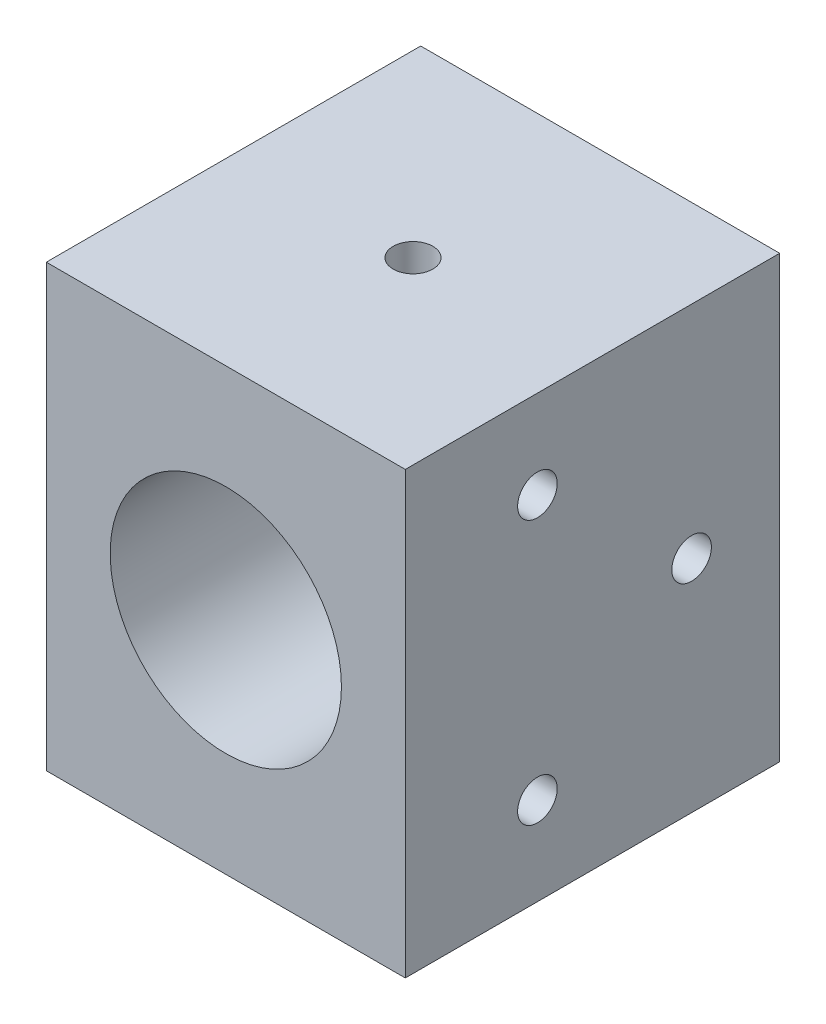
ISO-10303-21;
HEADER;
FILE_DESCRIPTION(('STEP AP214'),'2;1');
FILE_NAME('part.step','',(''),(''),'','','');
FILE_SCHEMA(('AUTOMOTIVE_DESIGN { 1 0 10303 214 1 1 1 1 }'));
ENDSEC;
DATA;
#1=APPLICATION_CONTEXT('core data for automotive mechanical design processes');
#2=APPLICATION_PROTOCOL_DEFINITION('international standard','automotive_design',2000,#1);
#3=PRODUCT_CONTEXT('',#1,'mechanical');
#4=PRODUCT('Part','Part','',(#3));
#5=PRODUCT_RELATED_PRODUCT_CATEGORY('part','',(#4));
#6=PRODUCT_DEFINITION_FORMATION('','',#4);
#7=PRODUCT_DEFINITION_CONTEXT('part definition',#1,'design');
#8=PRODUCT_DEFINITION('design','',#6,#7);
#9=PRODUCT_DEFINITION_SHAPE('','',#8);
#10=(LENGTH_UNIT() NAMED_UNIT(*) SI_UNIT(.MILLI.,.METRE.));
#11=(NAMED_UNIT(*) PLANE_ANGLE_UNIT() SI_UNIT($,.RADIAN.));
#12=(NAMED_UNIT(*) SI_UNIT($,.STERADIAN.) SOLID_ANGLE_UNIT());
#13=UNCERTAINTY_MEASURE_WITH_UNIT(LENGTH_MEASURE(1.E-05),#10,'distance_accuracy_value','');
#14=(GEOMETRIC_REPRESENTATION_CONTEXT(3) GLOBAL_UNCERTAINTY_ASSIGNED_CONTEXT((#13)) GLOBAL_UNIT_ASSIGNED_CONTEXT((#10,
#11,#12)) REPRESENTATION_CONTEXT('',''));
#15=CARTESIAN_POINT('',(0.,0.,0.));
#16=DIRECTION('',(0.,0.,1.));
#17=DIRECTION('',(1.,0.,0.));
#18=AXIS2_PLACEMENT_3D('',#15,#16,#17);
#19=CARTESIAN_POINT('',(0.,0.,10.));
#20=DIRECTION('',(0.,0.,1.));
#21=DIRECTION('',(1.,0.,0.));
#22=AXIS2_PLACEMENT_3D('',#19,#20,#21);
#23=PLANE('',#22);
#24=DIRECTION('',(0.,-1.,0.));
#25=VECTOR('',#24,1.);
#26=CARTESIAN_POINT('',(-8.15,10.,10.));
#27=LINE('',#26,#25);
#28=CARTESIAN_POINT('',(-8.15,10.,10.));
#29=VERTEX_POINT('',#28);
#30=CARTESIAN_POINT('',(-8.15,-10.,10.));
#31=VERTEX_POINT('',#30);
#32=EDGE_CURVE('E135',#29,#31,#27,.T.);
#33=ORIENTED_EDGE('',*,*,#32,.T.);
#34=DIRECTION('',(1.,0.,0.));
#35=VECTOR('',#34,1.);
#36=CARTESIAN_POINT('',(-8.15,-10.,10.));
#37=LINE('',#36,#35);
#38=CARTESIAN_POINT('',(8.15,-10.,10.));
#39=VERTEX_POINT('',#38);
#40=EDGE_CURVE('E139',#31,#39,#37,.T.);
#41=ORIENTED_EDGE('',*,*,#40,.T.);
#42=DIRECTION('',(0.,1.,0.));
#43=VECTOR('',#42,1.);
#44=CARTESIAN_POINT('',(8.15,10.,10.));
#45=LINE('',#44,#43);
#46=CARTESIAN_POINT('',(8.15,10.,10.));
#47=VERTEX_POINT('',#46);
#48=EDGE_CURVE('E59',#39,#47,#45,.T.);
#49=ORIENTED_EDGE('',*,*,#48,.T.);
#50=DIRECTION('',(-1.,0.,0.));
#51=VECTOR('',#50,1.);
#52=CARTESIAN_POINT('',(-8.15,10.,10.));
#53=LINE('',#52,#51);
#54=EDGE_CURVE('E54',#47,#29,#53,.T.);
#55=ORIENTED_EDGE('',*,*,#54,.T.);
#56=EDGE_LOOP('',(#33,#41,#49,#55));
#57=FACE_BOUND('',#56,.T.);
#58=CARTESIAN_POINT('',(0.,0.,10.));
#59=DIRECTION('',(0.,0.,1.));
#60=DIRECTION('',(1.,0.,0.));
#61=AXIS2_PLACEMENT_3D('',#58,#59,#60);
#62=CIRCLE('',#61,5.25);
#63=CARTESIAN_POINT('',(5.25,0.,10.));
#64=VERTEX_POINT('',#63);
#65=EDGE_CURVE('E132',#64,#64,#62,.T.);
#66=ORIENTED_EDGE('',*,*,#65,.F.);
#67=EDGE_LOOP('',(#66));
#68=FACE_BOUND('',#67,.T.);
#69=ADVANCED_FACE('F39',(#57,#68),#23,.T.);
#70=CARTESIAN_POINT('',(-8.15,10.,10.));
#71=DIRECTION('',(1.,0.,0.));
#72=DIRECTION('',(0.,1.,0.));
#73=AXIS2_PLACEMENT_3D('',#70,#71,#72);
#74=PLANE('',#73);
#75=CARTESIAN_POINT('',(-8.15,0.,-3.));
#76=DIRECTION('',(-1.,0.,0.));
#77=DIRECTION('',(0.,-1.,0.));
#78=AXIS2_PLACEMENT_3D('',#75,#76,#77);
#79=CIRCLE('',#78,0.899999999999999);
#80=CARTESIAN_POINT('',(-8.15,-0.9,-3.));
#81=VERTEX_POINT('',#80);
#82=EDGE_CURVE('E100',#81,#81,#79,.T.);
#83=ORIENTED_EDGE('',*,*,#82,.F.);
#84=EDGE_LOOP('',(#83));
#85=FACE_BOUND('',#84,.T.);
#86=CARTESIAN_POINT('',(-8.15,6.,4.));
#87=DIRECTION('',(-1.,0.,0.));
#88=DIRECTION('',(0.,-1.,0.));
#89=AXIS2_PLACEMENT_3D('',#86,#87,#88);
#90=CIRCLE('',#89,0.899999999999999);
#91=CARTESIAN_POINT('',(-8.15,5.1,4.));
#92=VERTEX_POINT('',#91);
#93=EDGE_CURVE('E124',#92,#92,#90,.T.);
#94=ORIENTED_EDGE('',*,*,#93,.F.);
#95=EDGE_LOOP('',(#94));
#96=FACE_BOUND('',#95,.T.);
#97=CARTESIAN_POINT('',(-8.15,-6.,4.));
#98=DIRECTION('',(-1.,0.,0.));
#99=DIRECTION('',(0.,-1.,0.));
#100=AXIS2_PLACEMENT_3D('',#97,#98,#99);
#101=CIRCLE('',#100,0.899999999999999);
#102=CARTESIAN_POINT('',(-8.15,-6.9,4.));
#103=VERTEX_POINT('',#102);
#104=EDGE_CURVE('E127',#103,#103,#101,.T.);
#105=ORIENTED_EDGE('',*,*,#104,.F.);
#106=EDGE_LOOP('',(#105));
#107=FACE_BOUND('',#106,.T.);
#108=DIRECTION('',(0.,0.,-1.));
#109=VECTOR('',#108,1.);
#110=CARTESIAN_POINT('',(-8.15,10.,10.));
#111=LINE('',#110,#109);
#112=CARTESIAN_POINT('',(-8.15,10.,-7.));
#113=VERTEX_POINT('',#112);
#114=EDGE_CURVE('E143',#29,#113,#111,.T.);
#115=ORIENTED_EDGE('',*,*,#114,.T.);
#116=DIRECTION('',(0.,-1.,0.));
#117=VECTOR('',#116,1.);
#118=CARTESIAN_POINT('',(-8.15,10.,-7.));
#119=LINE('',#118,#117);
#120=CARTESIAN_POINT('',(-8.15,-10.000000000002,-7.));
#121=VERTEX_POINT('',#120);
#122=EDGE_CURVE('E104',#113,#121,#119,.T.);
#123=ORIENTED_EDGE('',*,*,#122,.T.);
#124=DIRECTION('',(0.,0.,-1.));
#125=VECTOR('',#124,1.);
#126=CARTESIAN_POINT('',(-8.15,-10.,10.));
#127=LINE('',#126,#125);
#128=EDGE_CURVE('E11',#31,#121,#127,.T.);
#129=ORIENTED_EDGE('',*,*,#128,.F.);
#130=ORIENTED_EDGE('',*,*,#32,.F.);
#131=EDGE_LOOP('',(#115,#123,#129,#130));
#132=FACE_BOUND('',#131,.T.);
#133=ADVANCED_FACE('F41',(#85,#96,#107,#132),#74,.F.);
#134=CARTESIAN_POINT('',(-8.15,-10.,10.));
#135=DIRECTION('',(0.,1.,0.));
#136=DIRECTION('',(0.,0.,1.));
#137=AXIS2_PLACEMENT_3D('',#134,#135,#136);
#138=PLANE('',#137);
#139=CARTESIAN_POINT('',(0.,-10.,1.5));
#140=DIRECTION('',(0.,-1.,0.));
#141=DIRECTION('',(0.,0.,-1.));
#142=AXIS2_PLACEMENT_3D('',#139,#140,#141);
#143=CIRCLE('',#142,0.9);
#144=CARTESIAN_POINT('',(0.,-10.,0.6));
#145=VERTEX_POINT('',#144);
#146=EDGE_CURVE('E187',#145,#145,#143,.T.);
#147=ORIENTED_EDGE('',*,*,#146,.F.);
#148=EDGE_LOOP('',(#147));
#149=FACE_BOUND('',#148,.T.);
#150=ORIENTED_EDGE('',*,*,#128,.T.);
#151=DIRECTION('',(1.,0.,0.));
#152=VECTOR('',#151,1.);
#153=CARTESIAN_POINT('',(-28.7655281280902,-10.000000000002,-7.));
#154=LINE('',#153,#152);
#155=CARTESIAN_POINT('',(8.15,-10.000000000002,-7.));
#156=VERTEX_POINT('',#155);
#157=EDGE_CURVE('E86',#121,#156,#154,.T.);
#158=ORIENTED_EDGE('',*,*,#157,.T.);
#159=DIRECTION('',(0.,0.,-1.));
#160=VECTOR('',#159,1.);
#161=CARTESIAN_POINT('',(8.15,-10.,10.));
#162=LINE('',#161,#160);
#163=EDGE_CURVE('E47',#39,#156,#162,.T.);
#164=ORIENTED_EDGE('',*,*,#163,.F.);
#165=ORIENTED_EDGE('',*,*,#40,.F.);
#166=EDGE_LOOP('',(#150,#158,#164,#165));
#167=FACE_BOUND('',#166,.T.);
#168=ADVANCED_FACE('F87',(#149,#167),#138,.F.);
#169=CARTESIAN_POINT('',(8.15,10.,10.));
#170=DIRECTION('',(-1.,0.,0.));
#171=DIRECTION('',(0.,-1.,0.));
#172=AXIS2_PLACEMENT_3D('',#169,#170,#171);
#173=PLANE('',#172);
#174=CARTESIAN_POINT('',(8.15,0.,-3.));
#175=DIRECTION('',(-1.,0.,0.));
#176=DIRECTION('',(0.,-1.,0.));
#177=AXIS2_PLACEMENT_3D('',#174,#175,#176);
#178=CIRCLE('',#177,0.899999999999999);
#179=CARTESIAN_POINT('',(8.15,-0.899999999999998,-3.));
#180=VERTEX_POINT('',#179);
#181=EDGE_CURVE('E97',#180,#180,#178,.T.);
#182=ORIENTED_EDGE('',*,*,#181,.T.);
#183=EDGE_LOOP('',(#182));
#184=FACE_BOUND('',#183,.T.);
#185=CARTESIAN_POINT('',(8.15,6.,4.));
#186=DIRECTION('',(-1.,0.,0.));
#187=DIRECTION('',(0.,-1.,0.));
#188=AXIS2_PLACEMENT_3D('',#185,#186,#187);
#189=CIRCLE('',#188,0.899999999999999);
#190=CARTESIAN_POINT('',(8.15,5.1,4.));
#191=VERTEX_POINT('',#190);
#192=EDGE_CURVE('E111',#191,#191,#189,.T.);
#193=ORIENTED_EDGE('',*,*,#192,.T.);
#194=EDGE_LOOP('',(#193));
#195=FACE_BOUND('',#194,.T.);
#196=CARTESIAN_POINT('',(8.15,-6.,4.));
#197=DIRECTION('',(-1.,0.,0.));
#198=DIRECTION('',(0.,-1.,0.));
#199=AXIS2_PLACEMENT_3D('',#196,#197,#198);
#200=CIRCLE('',#199,0.899999999999999);
#201=CARTESIAN_POINT('',(8.15,-6.9,4.));
#202=VERTEX_POINT('',#201);
#203=EDGE_CURVE('E117',#202,#202,#200,.T.);
#204=ORIENTED_EDGE('',*,*,#203,.T.);
#205=EDGE_LOOP('',(#204));
#206=FACE_BOUND('',#205,.T.);
#207=ORIENTED_EDGE('',*,*,#163,.T.);
#208=DIRECTION('',(0.,1.,0.));
#209=VECTOR('',#208,1.);
#210=CARTESIAN_POINT('',(8.15,10.,-7.));
#211=LINE('',#210,#209);
#212=CARTESIAN_POINT('',(8.15,10.,-7.));
#213=VERTEX_POINT('',#212);
#214=EDGE_CURVE('E82',#156,#213,#211,.T.);
#215=ORIENTED_EDGE('',*,*,#214,.T.);
#216=DIRECTION('',(0.,0.,-1.));
#217=VECTOR('',#216,1.);
#218=CARTESIAN_POINT('',(8.15,10.,10.));
#219=LINE('',#218,#217);
#220=EDGE_CURVE('E84',#47,#213,#219,.T.);
#221=ORIENTED_EDGE('',*,*,#220,.F.);
#222=ORIENTED_EDGE('',*,*,#48,.F.);
#223=EDGE_LOOP('',(#207,#215,#221,#222));
#224=FACE_BOUND('',#223,.T.);
#225=ADVANCED_FACE('F80',(#184,#195,#206,#224),#173,.F.);
#226=CARTESIAN_POINT('',(-8.15,10.,10.));
#227=DIRECTION('',(0.,-1.,0.));
#228=DIRECTION('',(0.,0.,-1.));
#229=AXIS2_PLACEMENT_3D('',#226,#227,#228);
#230=PLANE('',#229);
#231=CARTESIAN_POINT('',(0.,10.,1.5));
#232=DIRECTION('',(0.,-1.,0.));
#233=DIRECTION('',(0.,0.,-1.));
#234=AXIS2_PLACEMENT_3D('',#231,#232,#233);
#235=CIRCLE('',#234,0.9);
#236=CARTESIAN_POINT('',(0.,10.,0.6));
#237=VERTEX_POINT('',#236);
#238=EDGE_CURVE('E195',#237,#237,#235,.T.);
#239=ORIENTED_EDGE('',*,*,#238,.T.);
#240=EDGE_LOOP('',(#239));
#241=FACE_BOUND('',#240,.T.);
#242=ORIENTED_EDGE('',*,*,#220,.T.);
#243=DIRECTION('',(1.,0.,0.));
#244=VECTOR('',#243,1.);
#245=CARTESIAN_POINT('',(-28.7655281280902,10.,-7.));
#246=LINE('',#245,#244);
#247=EDGE_CURVE('E92',#113,#213,#246,.T.);
#248=ORIENTED_EDGE('',*,*,#247,.F.);
#249=ORIENTED_EDGE('',*,*,#114,.F.);
#250=ORIENTED_EDGE('',*,*,#54,.F.);
#251=EDGE_LOOP('',(#242,#248,#249,#250));
#252=FACE_BOUND('',#251,.T.);
#253=ADVANCED_FACE('F146',(#241,#252),#230,.F.);
#254=CARTESIAN_POINT('',(0.,0.,10.));
#255=DIRECTION('',(0.,0.,-1.));
#256=DIRECTION('',(-1.,0.,0.));
#257=AXIS2_PLACEMENT_3D('',#254,#255,#256);
#258=CYLINDRICAL_SURFACE('',#257,5.25);
#259=ORIENTED_EDGE('',*,*,#65,.T.);
#260=EDGE_LOOP('',(#259));
#261=FACE_BOUND('',#260,.T.);
#262=CARTESIAN_POINT('',(0.,0.,0.));
#263=DIRECTION('',(0.,0.,1.));
#264=DIRECTION('',(1.,0.,0.));
#265=AXIS2_PLACEMENT_3D('',#262,#263,#264);
#266=CIRCLE('',#265,5.25);
#267=CARTESIAN_POINT('',(5.25,0.,0.));
#268=VERTEX_POINT('',#267);
#269=EDGE_CURVE('E123',#268,#268,#266,.T.);
#270=ORIENTED_EDGE('',*,*,#269,.F.);
#271=EDGE_LOOP('',(#270));
#272=FACE_BOUND('',#271,.T.);
#273=ADVANCED_FACE('F154',(#261,#272),#258,.F.);
#274=CARTESIAN_POINT('',(0.,0.,0.));
#275=DIRECTION('',(0.,0.,-1.));
#276=DIRECTION('',(-1.,0.,0.));
#277=AXIS2_PLACEMENT_3D('',#274,#275,#276);
#278=PLANE('',#277);
#279=ORIENTED_EDGE('',*,*,#269,.T.);
#280=EDGE_LOOP('',(#279));
#281=FACE_BOUND('',#280,.T.);
#282=ADVANCED_FACE('F157',(#281),#278,.F.);
#283=CARTESIAN_POINT('',(-4.15,-6.,4.));
#284=DIRECTION('',(-1.,0.,0.));
#285=DIRECTION('',(0.,-1.,0.));
#286=AXIS2_PLACEMENT_3D('',#283,#284,#285);
#287=CYLINDRICAL_SURFACE('',#286,0.899999999999999);
#288=CARTESIAN_POINT('',(-4.15,-6.,4.));
#289=DIRECTION('',(-1.,0.,0.));
#290=DIRECTION('',(0.,-1.,0.));
#291=AXIS2_PLACEMENT_3D('',#288,#289,#290);
#292=CIRCLE('',#291,0.899999999999999);
#293=CARTESIAN_POINT('',(-4.15,-6.9,4.));
#294=VERTEX_POINT('',#293);
#295=EDGE_CURVE('E110',#294,#294,#292,.T.);
#296=ORIENTED_EDGE('',*,*,#295,.F.);
#297=EDGE_LOOP('',(#296));
#298=FACE_BOUND('',#297,.T.);
#299=ORIENTED_EDGE('',*,*,#104,.T.);
#300=EDGE_LOOP('',(#299));
#301=FACE_BOUND('',#300,.T.);
#302=ADVANCED_FACE('F162',(#298,#301),#287,.F.);
#303=CARTESIAN_POINT('',(-4.15,-6.,4.));
#304=DIRECTION('',(-1.,0.,0.));
#305=DIRECTION('',(0.,-1.,0.));
#306=AXIS2_PLACEMENT_3D('',#303,#304,#305);
#307=PLANE('',#306);
#308=ORIENTED_EDGE('',*,*,#295,.T.);
#309=EDGE_LOOP('',(#308));
#310=FACE_BOUND('',#309,.T.);
#311=ADVANCED_FACE('F167',(#310),#307,.T.);
#312=CARTESIAN_POINT('',(-4.15,6.,4.));
#313=DIRECTION('',(-1.,0.,0.));
#314=DIRECTION('',(0.,-1.,0.));
#315=AXIS2_PLACEMENT_3D('',#312,#313,#314);
#316=CYLINDRICAL_SURFACE('',#315,0.899999999999999);
#317=CARTESIAN_POINT('',(-4.15,6.,4.));
#318=DIRECTION('',(-1.,0.,0.));
#319=DIRECTION('',(0.,-1.,0.));
#320=AXIS2_PLACEMENT_3D('',#317,#318,#319);
#321=CIRCLE('',#320,0.899999999999999);
#322=CARTESIAN_POINT('',(-4.15,5.1,4.));
#323=VERTEX_POINT('',#322);
#324=EDGE_CURVE('E120',#323,#323,#321,.T.);
#325=ORIENTED_EDGE('',*,*,#324,.F.);
#326=EDGE_LOOP('',(#325));
#327=FACE_BOUND('',#326,.T.);
#328=ORIENTED_EDGE('',*,*,#93,.T.);
#329=EDGE_LOOP('',(#328));
#330=FACE_BOUND('',#329,.T.);
#331=ADVANCED_FACE('F208',(#327,#330),#316,.F.);
#332=CARTESIAN_POINT('',(-4.15,6.,4.));
#333=DIRECTION('',(-1.,0.,0.));
#334=DIRECTION('',(0.,-1.,0.));
#335=AXIS2_PLACEMENT_3D('',#332,#333,#334);
#336=PLANE('',#335);
#337=ORIENTED_EDGE('',*,*,#324,.T.);
#338=EDGE_LOOP('',(#337));
#339=FACE_BOUND('',#338,.T.);
#340=ADVANCED_FACE('F210',(#339),#336,.T.);
#341=CARTESIAN_POINT('',(4.15,-6.,4.));
#342=DIRECTION('',(1.,0.,0.));
#343=DIRECTION('',(0.,1.,0.));
#344=AXIS2_PLACEMENT_3D('',#341,#342,#343);
#345=CYLINDRICAL_SURFACE('',#344,0.899999999999999);
#346=CARTESIAN_POINT('',(4.15,-6.,4.));
#347=DIRECTION('',(-1.,0.,0.));
#348=DIRECTION('',(0.,-1.,0.));
#349=AXIS2_PLACEMENT_3D('',#346,#347,#348);
#350=CIRCLE('',#349,0.899999999999999);
#351=CARTESIAN_POINT('',(4.15,-6.9,4.));
#352=VERTEX_POINT('',#351);
#353=EDGE_CURVE('E114',#352,#352,#350,.T.);
#354=ORIENTED_EDGE('',*,*,#353,.T.);
#355=EDGE_LOOP('',(#354));
#356=FACE_BOUND('',#355,.T.);
#357=ORIENTED_EDGE('',*,*,#203,.F.);
#358=EDGE_LOOP('',(#357));
#359=FACE_BOUND('',#358,.T.);
#360=ADVANCED_FACE('F217',(#356,#359),#345,.F.);
#361=CARTESIAN_POINT('',(4.15,-6.,4.));
#362=DIRECTION('',(-1.,0.,0.));
#363=DIRECTION('',(0.,-1.,0.));
#364=AXIS2_PLACEMENT_3D('',#361,#362,#363);
#365=PLANE('',#364);
#366=ORIENTED_EDGE('',*,*,#353,.F.);
#367=EDGE_LOOP('',(#366));
#368=FACE_BOUND('',#367,.T.);
#369=ADVANCED_FACE('F225',(#368),#365,.F.);
#370=CARTESIAN_POINT('',(4.15,6.,4.));
#371=DIRECTION('',(1.,0.,0.));
#372=DIRECTION('',(0.,1.,0.));
#373=AXIS2_PLACEMENT_3D('',#370,#371,#372);
#374=CYLINDRICAL_SURFACE('',#373,0.899999999999999);
#375=CARTESIAN_POINT('',(4.15,6.,4.));
#376=DIRECTION('',(-1.,0.,0.));
#377=DIRECTION('',(0.,-1.,0.));
#378=AXIS2_PLACEMENT_3D('',#375,#376,#377);
#379=CIRCLE('',#378,0.899999999999999);
#380=CARTESIAN_POINT('',(4.15,5.1,4.));
#381=VERTEX_POINT('',#380);
#382=EDGE_CURVE('E107',#381,#381,#379,.T.);
#383=ORIENTED_EDGE('',*,*,#382,.T.);
#384=EDGE_LOOP('',(#383));
#385=FACE_BOUND('',#384,.T.);
#386=ORIENTED_EDGE('',*,*,#192,.F.);
#387=EDGE_LOOP('',(#386));
#388=FACE_BOUND('',#387,.T.);
#389=ADVANCED_FACE('F229',(#385,#388),#374,.F.);
#390=CARTESIAN_POINT('',(4.15,6.,4.));
#391=DIRECTION('',(-1.,0.,0.));
#392=DIRECTION('',(0.,-1.,0.));
#393=AXIS2_PLACEMENT_3D('',#390,#391,#392);
#394=PLANE('',#393);
#395=ORIENTED_EDGE('',*,*,#382,.F.);
#396=EDGE_LOOP('',(#395));
#397=FACE_BOUND('',#396,.T.);
#398=ADVANCED_FACE('F233',(#397),#394,.F.);
#399=CARTESIAN_POINT('',(-28.7655281280902,10.,-7.));
#400=DIRECTION('',(0.,0.,-1.));
#401=DIRECTION('',(0.,1.,0.));
#402=AXIS2_PLACEMENT_3D('',#399,#400,#401);
#403=PLANE('',#402);
#404=ORIENTED_EDGE('',*,*,#122,.F.);
#405=ORIENTED_EDGE('',*,*,#247,.T.);
#406=ORIENTED_EDGE('',*,*,#214,.F.);
#407=ORIENTED_EDGE('',*,*,#157,.F.);
#408=EDGE_LOOP('',(#404,#405,#406,#407));
#409=FACE_BOUND('',#408,.T.);
#410=ADVANCED_FACE('F95',(#409),#403,.T.);
#411=CARTESIAN_POINT('',(8.15,0.,-3.));
#412=DIRECTION('',(-1.,0.,0.));
#413=DIRECTION('',(0.,-1.,0.));
#414=AXIS2_PLACEMENT_3D('',#411,#412,#413);
#415=CYLINDRICAL_SURFACE('',#414,0.899999999999999);
#416=ORIENTED_EDGE('',*,*,#181,.F.);
#417=EDGE_LOOP('',(#416));
#418=FACE_BOUND('',#417,.T.);
#419=ORIENTED_EDGE('',*,*,#82,.T.);
#420=EDGE_LOOP('',(#419));
#421=FACE_BOUND('',#420,.T.);
#422=ADVANCED_FACE('F201',(#418,#421),#415,.F.);
#423=CARTESIAN_POINT('',(0.,-6.,1.5));
#424=DIRECTION('',(0.,-1.,0.));
#425=DIRECTION('',(0.,0.,-1.));
#426=AXIS2_PLACEMENT_3D('',#423,#424,#425);
#427=CYLINDRICAL_SURFACE('',#426,0.9);
#428=CARTESIAN_POINT('',(0.,-6.,1.5));
#429=DIRECTION('',(0.,-1.,0.));
#430=DIRECTION('',(0.,0.,-1.));
#431=AXIS2_PLACEMENT_3D('',#428,#429,#430);
#432=CIRCLE('',#431,0.9);
#433=CARTESIAN_POINT('',(0.,-6.,0.6));
#434=VERTEX_POINT('',#433);
#435=EDGE_CURVE('E189',#434,#434,#432,.T.);
#436=ORIENTED_EDGE('',*,*,#435,.F.);
#437=EDGE_LOOP('',(#436));
#438=FACE_BOUND('',#437,.T.);
#439=ORIENTED_EDGE('',*,*,#146,.T.);
#440=EDGE_LOOP('',(#439));
#441=FACE_BOUND('',#440,.T.);
#442=ADVANCED_FACE('F242',(#438,#441),#427,.F.);
#443=CARTESIAN_POINT('',(0.,-6.,1.5));
#444=DIRECTION('',(0.,-1.,0.));
#445=DIRECTION('',(0.,0.,-1.));
#446=AXIS2_PLACEMENT_3D('',#443,#444,#445);
#447=PLANE('',#446);
#448=ORIENTED_EDGE('',*,*,#435,.T.);
#449=EDGE_LOOP('',(#448));
#450=FACE_BOUND('',#449,.T.);
#451=ADVANCED_FACE('F246',(#450),#447,.T.);
#452=CARTESIAN_POINT('',(0.,6.,1.5));
#453=DIRECTION('',(0.,1.,0.));
#454=DIRECTION('',(0.,0.,1.));
#455=AXIS2_PLACEMENT_3D('',#452,#453,#454);
#456=CYLINDRICAL_SURFACE('',#455,0.9);
#457=CARTESIAN_POINT('',(0.,6.,1.5));
#458=DIRECTION('',(0.,-1.,0.));
#459=DIRECTION('',(0.,0.,-1.));
#460=AXIS2_PLACEMENT_3D('',#457,#458,#459);
#461=CIRCLE('',#460,0.9);
#462=CARTESIAN_POINT('',(0.,6.,0.6));
#463=VERTEX_POINT('',#462);
#464=EDGE_CURVE('E190',#463,#463,#461,.T.);
#465=ORIENTED_EDGE('',*,*,#464,.T.);
#466=EDGE_LOOP('',(#465));
#467=FACE_BOUND('',#466,.T.);
#468=ORIENTED_EDGE('',*,*,#238,.F.);
#469=EDGE_LOOP('',(#468));
#470=FACE_BOUND('',#469,.T.);
#471=ADVANCED_FACE('F250',(#467,#470),#456,.F.);
#472=CARTESIAN_POINT('',(0.,6.,1.5));
#473=DIRECTION('',(0.,-1.,0.));
#474=DIRECTION('',(0.,0.,-1.));
#475=AXIS2_PLACEMENT_3D('',#472,#473,#474);
#476=PLANE('',#475);
#477=ORIENTED_EDGE('',*,*,#464,.F.);
#478=EDGE_LOOP('',(#477));
#479=FACE_BOUND('',#478,.T.);
#480=ADVANCED_FACE('F254',(#479),#476,.F.);
#481=CLOSED_SHELL('',(#69,#133,#168,#225,#253,#273,#282,#302,#311,#331,#340,#360,#369,#389,#398,
#410,#422,#442,#451,#471,#480));
#482=MANIFOLD_SOLID_BREP('B2',#481);
#483=ADVANCED_BREP_SHAPE_REPRESENTATION('',(#18,#482),#14);
#484=SHAPE_DEFINITION_REPRESENTATION(#9,#483);
ENDSEC;
END-ISO-10303-21;
